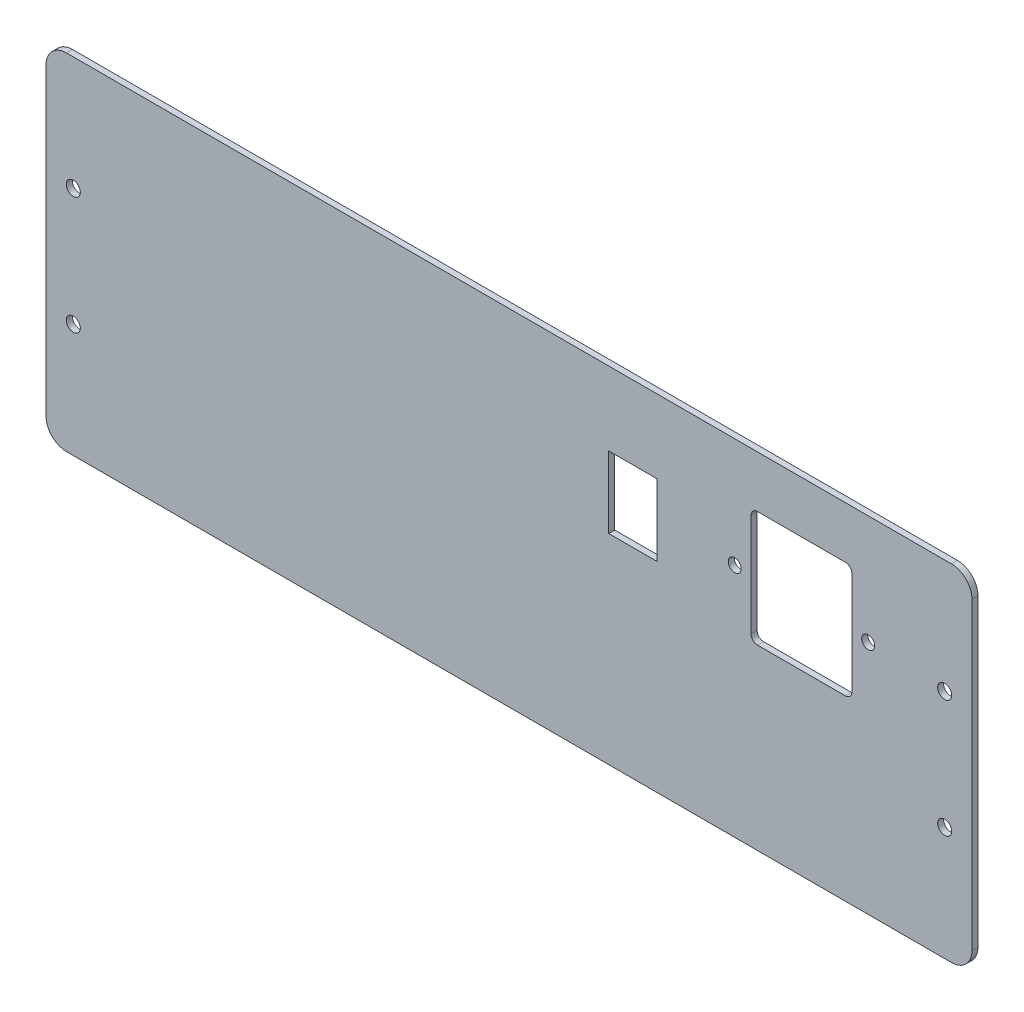
ISO-10303-21;
HEADER;
FILE_DESCRIPTION(('STEP AP214'),'2;1');
FILE_NAME('part.step','',(''),(''),'','','');
FILE_SCHEMA(('AUTOMOTIVE_DESIGN { 1 0 10303 214 1 1 1 1 }'));
ENDSEC;
DATA;
#1=APPLICATION_CONTEXT('core data for automotive mechanical design processes');
#2=APPLICATION_PROTOCOL_DEFINITION('international standard','automotive_design',2000,#1);
#3=PRODUCT_CONTEXT('',#1,'mechanical');
#4=PRODUCT('Part','Part','',(#3));
#5=PRODUCT_RELATED_PRODUCT_CATEGORY('part','',(#4));
#6=PRODUCT_DEFINITION_FORMATION('','',#4);
#7=PRODUCT_DEFINITION_CONTEXT('part definition',#1,'design');
#8=PRODUCT_DEFINITION('design','',#6,#7);
#9=PRODUCT_DEFINITION_SHAPE('','',#8);
#10=(LENGTH_UNIT() NAMED_UNIT(*) SI_UNIT(.MILLI.,.METRE.));
#11=(NAMED_UNIT(*) PLANE_ANGLE_UNIT() SI_UNIT($,.RADIAN.));
#12=(NAMED_UNIT(*) SI_UNIT($,.STERADIAN.) SOLID_ANGLE_UNIT());
#13=UNCERTAINTY_MEASURE_WITH_UNIT(LENGTH_MEASURE(1.E-05),#10,'distance_accuracy_value','');
#14=(GEOMETRIC_REPRESENTATION_CONTEXT(3) GLOBAL_UNCERTAINTY_ASSIGNED_CONTEXT((#13)) GLOBAL_UNIT_ASSIGNED_CONTEXT((#10,
#11,#12)) REPRESENTATION_CONTEXT('',''));
#15=CARTESIAN_POINT('',(0.,0.,0.));
#16=DIRECTION('',(0.,0.,1.));
#17=DIRECTION('',(1.,0.,0.));
#18=AXIS2_PLACEMENT_3D('',#15,#16,#17);
#19=CARTESIAN_POINT('',(0.,0.,-1.6256));
#20=DIRECTION('',(0.,0.,1.));
#21=DIRECTION('',(1.,0.,0.));
#22=AXIS2_PLACEMENT_3D('',#19,#20,#21);
#23=PLANE('',#22);
#24=CARTESIAN_POINT('',(60.9045,17.0291,-1.6256));
#25=DIRECTION('',(0.,0.,1.));
#26=DIRECTION('',(-1.,0.,0.));
#27=AXIS2_PLACEMENT_3D('',#24,#25,#26);
#28=CIRCLE('',#27,1.75);
#29=CARTESIAN_POINT('',(59.1545,17.0291,-1.6256));
#30=VERTEX_POINT('',#29);
#31=EDGE_CURVE('E222',#30,#30,#28,.T.);
#32=ORIENTED_EDGE('',*,*,#31,.T.);
#33=EDGE_LOOP('',(#32));
#34=FACE_BOUND('',#33,.T.);
#35=CARTESIAN_POINT('',(96.9045,17.0291,-1.6256));
#36=DIRECTION('',(0.,0.,1.));
#37=DIRECTION('',(-1.,0.,0.));
#38=AXIS2_PLACEMENT_3D('',#35,#36,#37);
#39=CIRCLE('',#38,1.75);
#40=CARTESIAN_POINT('',(95.1545,17.0291,-1.6256));
#41=VERTEX_POINT('',#40);
#42=EDGE_CURVE('E240',#41,#41,#39,.T.);
#43=ORIENTED_EDGE('',*,*,#42,.T.);
#44=EDGE_LOOP('',(#43));
#45=FACE_BOUND('',#44,.T.);
#46=DIRECTION('',(0.,-1.,0.));
#47=VECTOR('',#46,1.);
#48=CARTESIAN_POINT('',(-124.9045,41.0337,-1.6256));
#49=LINE('',#48,#47);
#50=CARTESIAN_POINT('',(-124.9045,41.0337,-1.6256));
#51=VERTEX_POINT('',#50);
#52=CARTESIAN_POINT('',(-124.9045,-41.0337,-1.6256));
#53=VERTEX_POINT('',#52);
#54=EDGE_CURVE('E290',#51,#53,#49,.T.);
#55=ORIENTED_EDGE('',*,*,#54,.F.);
#56=CARTESIAN_POINT('',(-119.3673,41.0337,-1.6256));
#57=DIRECTION('',(0.,0.,1.));
#58=DIRECTION('',(0.,1.,0.));
#59=AXIS2_PLACEMENT_3D('',#56,#57,#58);
#60=CIRCLE('',#59,5.5372);
#61=CARTESIAN_POINT('',(-119.3673,46.5709,-1.6256));
#62=VERTEX_POINT('',#61);
#63=EDGE_CURVE('E318',#62,#51,#60,.T.);
#64=ORIENTED_EDGE('',*,*,#63,.F.);
#65=DIRECTION('',(-1.,0.,0.));
#66=VECTOR('',#65,1.);
#67=CARTESIAN_POINT('',(119.3673,46.5709,-1.6256));
#68=LINE('',#67,#66);
#69=CARTESIAN_POINT('',(119.3673,46.5709,-1.6256));
#70=VERTEX_POINT('',#69);
#71=EDGE_CURVE('E300',#70,#62,#68,.T.);
#72=ORIENTED_EDGE('',*,*,#71,.F.);
#73=CARTESIAN_POINT('',(119.3673,41.0337,-1.6256));
#74=DIRECTION('',(0.,0.,1.));
#75=DIRECTION('',(1.,0.,0.));
#76=AXIS2_PLACEMENT_3D('',#73,#74,#75);
#77=CIRCLE('',#76,5.5372);
#78=CARTESIAN_POINT('',(124.9045,41.0337,-1.6256));
#79=VERTEX_POINT('',#78);
#80=EDGE_CURVE('E299',#79,#70,#77,.T.);
#81=ORIENTED_EDGE('',*,*,#80,.F.);
#82=DIRECTION('',(0.,1.,0.));
#83=VECTOR('',#82,1.);
#84=CARTESIAN_POINT('',(124.9045,-41.0337,-1.6256));
#85=LINE('',#84,#83);
#86=CARTESIAN_POINT('',(124.9045,-41.0337,-1.6256));
#87=VERTEX_POINT('',#86);
#88=EDGE_CURVE('E284',#87,#79,#85,.T.);
#89=ORIENTED_EDGE('',*,*,#88,.F.);
#90=CARTESIAN_POINT('',(119.3673,-41.0337,-1.6256));
#91=DIRECTION('',(0.,0.,1.));
#92=DIRECTION('',(0.,-1.,0.));
#93=AXIS2_PLACEMENT_3D('',#90,#91,#92);
#94=CIRCLE('',#93,5.5372);
#95=CARTESIAN_POINT('',(119.3673,-46.5709,-1.6256));
#96=VERTEX_POINT('',#95);
#97=EDGE_CURVE('E283',#96,#87,#94,.T.);
#98=ORIENTED_EDGE('',*,*,#97,.F.);
#99=DIRECTION('',(1.,0.,0.));
#100=VECTOR('',#99,1.);
#101=CARTESIAN_POINT('',(-119.3673,-46.5709,-1.6256));
#102=LINE('',#101,#100);
#103=CARTESIAN_POINT('',(-119.3673,-46.5709,-1.6256));
#104=VERTEX_POINT('',#103);
#105=EDGE_CURVE('E276',#104,#96,#102,.T.);
#106=ORIENTED_EDGE('',*,*,#105,.F.);
#107=CARTESIAN_POINT('',(-119.3673,-41.0337,-1.6256));
#108=DIRECTION('',(0.,0.,1.));
#109=DIRECTION('',(-1.,0.,0.));
#110=AXIS2_PLACEMENT_3D('',#107,#108,#109);
#111=CIRCLE('',#110,5.5372);
#112=EDGE_CURVE('E275',#53,#104,#111,.T.);
#113=ORIENTED_EDGE('',*,*,#112,.F.);
#114=EDGE_LOOP('',(#55,#64,#72,#81,#89,#98,#106,#113));
#115=FACE_BOUND('',#114,.T.);
#116=CARTESIAN_POINT('',(117.5385,-15.8877,-1.6256));
#117=DIRECTION('',(0.,0.,1.));
#118=DIRECTION('',(-1.,0.,0.));
#119=AXIS2_PLACEMENT_3D('',#116,#117,#118);
#120=CIRCLE('',#119,1.8923);
#121=CARTESIAN_POINT('',(115.6462,-15.8877,-1.6256));
#122=VERTEX_POINT('',#121);
#123=EDGE_CURVE('E285',#122,#122,#120,.T.);
#124=ORIENTED_EDGE('',*,*,#123,.T.);
#125=EDGE_LOOP('',(#124));
#126=FACE_BOUND('',#125,.T.);
#127=CARTESIAN_POINT('',(117.5385,15.8623,-1.6256));
#128=DIRECTION('',(0.,0.,1.));
#129=DIRECTION('',(-1.,0.,0.));
#130=AXIS2_PLACEMENT_3D('',#127,#128,#129);
#131=CIRCLE('',#130,1.8923);
#132=CARTESIAN_POINT('',(115.6462,15.8623,-1.6256));
#133=VERTEX_POINT('',#132);
#134=EDGE_CURVE('E265',#133,#133,#131,.T.);
#135=ORIENTED_EDGE('',*,*,#134,.T.);
#136=EDGE_LOOP('',(#135));
#137=FACE_BOUND('',#136,.T.);
#138=CARTESIAN_POINT('',(-117.5385,-15.8877,-1.6256));
#139=DIRECTION('',(0.,0.,1.));
#140=DIRECTION('',(-1.,0.,0.));
#141=AXIS2_PLACEMENT_3D('',#138,#139,#140);
#142=CIRCLE('',#141,1.8923);
#143=CARTESIAN_POINT('',(-119.4308,-15.8877,-1.6256));
#144=VERTEX_POINT('',#143);
#145=EDGE_CURVE('E261',#144,#144,#142,.T.);
#146=ORIENTED_EDGE('',*,*,#145,.T.);
#147=EDGE_LOOP('',(#146));
#148=FACE_BOUND('',#147,.T.);
#149=CARTESIAN_POINT('',(-117.5385,15.8623,-1.6256));
#150=DIRECTION('',(0.,0.,1.));
#151=DIRECTION('',(-1.,0.,0.));
#152=AXIS2_PLACEMENT_3D('',#149,#150,#151);
#153=CIRCLE('',#152,1.8923);
#154=CARTESIAN_POINT('',(-119.4308,15.8623,-1.6256));
#155=VERTEX_POINT('',#154);
#156=EDGE_CURVE('E266',#155,#155,#153,.T.);
#157=ORIENTED_EDGE('',*,*,#156,.T.);
#158=EDGE_LOOP('',(#157));
#159=FACE_BOUND('',#158,.T.);
#160=DIRECTION('',(-1.,0.,0.));
#161=VECTOR('',#160,1.);
#162=CARTESIAN_POINT('',(92.5045,32.6291,-1.6256));
#163=LINE('',#162,#161);
#164=CARTESIAN_POINT('',(90.7545,32.6291,-1.6256));
#165=VERTEX_POINT('',#164);
#166=CARTESIAN_POINT('',(67.0545,32.6291,-1.6256));
#167=VERTEX_POINT('',#166);
#168=EDGE_CURVE('E234',#165,#167,#163,.T.);
#169=ORIENTED_EDGE('',*,*,#168,.T.);
#170=CARTESIAN_POINT('',(67.0545,30.8791,-1.6256));
#171=DIRECTION('',(0.,0.,1.));
#172=DIRECTION('',(1.,0.,0.));
#173=AXIS2_PLACEMENT_3D('',#170,#171,#172);
#174=CIRCLE('',#173,1.75);
#175=CARTESIAN_POINT('',(65.3045,30.8791,-1.6256));
#176=VERTEX_POINT('',#175);
#177=EDGE_CURVE('E34',#167,#176,#174,.T.);
#178=ORIENTED_EDGE('',*,*,#177,.T.);
#179=DIRECTION('',(0.,-1.,0.));
#180=VECTOR('',#179,1.);
#181=CARTESIAN_POINT('',(65.3045,32.6291,-1.6256));
#182=LINE('',#181,#180);
#183=CARTESIAN_POINT('',(65.3045,3.1791,-1.6256));
#184=VERTEX_POINT('',#183);
#185=EDGE_CURVE('E237',#176,#184,#182,.T.);
#186=ORIENTED_EDGE('',*,*,#185,.T.);
#187=CARTESIAN_POINT('',(67.0545,3.1791,-1.6256));
#188=DIRECTION('',(0.,0.,1.));
#189=DIRECTION('',(1.,0.,0.));
#190=AXIS2_PLACEMENT_3D('',#187,#188,#189);
#191=CIRCLE('',#190,1.75);
#192=CARTESIAN_POINT('',(67.0545,1.4291,-1.6256));
#193=VERTEX_POINT('',#192);
#194=EDGE_CURVE('E424',#184,#193,#191,.T.);
#195=ORIENTED_EDGE('',*,*,#194,.T.);
#196=DIRECTION('',(1.,0.,0.));
#197=VECTOR('',#196,1.);
#198=CARTESIAN_POINT('',(65.3045,1.4291,-1.6256));
#199=LINE('',#198,#197);
#200=CARTESIAN_POINT('',(90.7545,1.4291,-1.6256));
#201=VERTEX_POINT('',#200);
#202=EDGE_CURVE('E230',#193,#201,#199,.T.);
#203=ORIENTED_EDGE('',*,*,#202,.T.);
#204=CARTESIAN_POINT('',(90.7545,3.1791,-1.6256));
#205=DIRECTION('',(0.,0.,1.));
#206=DIRECTION('',(1.,0.,0.));
#207=AXIS2_PLACEMENT_3D('',#204,#205,#206);
#208=CIRCLE('',#207,1.75);
#209=CARTESIAN_POINT('',(92.5045,3.1791,-1.6256));
#210=VERTEX_POINT('',#209);
#211=EDGE_CURVE('E411',#201,#210,#208,.T.);
#212=ORIENTED_EDGE('',*,*,#211,.T.);
#213=DIRECTION('',(0.,1.,0.));
#214=VECTOR('',#213,1.);
#215=CARTESIAN_POINT('',(92.5045,1.4291,-1.6256));
#216=LINE('',#215,#214);
#217=CARTESIAN_POINT('',(92.5045,30.8791,-1.6256));
#218=VERTEX_POINT('',#217);
#219=EDGE_CURVE('E231',#210,#218,#216,.T.);
#220=ORIENTED_EDGE('',*,*,#219,.T.);
#221=CARTESIAN_POINT('',(90.7545,30.8791,-1.6256));
#222=DIRECTION('',(0.,0.,1.));
#223=DIRECTION('',(1.,0.,0.));
#224=AXIS2_PLACEMENT_3D('',#221,#222,#223);
#225=CIRCLE('',#224,1.75);
#226=EDGE_CURVE('E398',#218,#165,#225,.T.);
#227=ORIENTED_EDGE('',*,*,#226,.T.);
#228=EDGE_LOOP('',(#169,#178,#186,#195,#203,#212,#220,#227));
#229=FACE_BOUND('',#228,.T.);
#230=DIRECTION('',(-1.,0.,0.));
#231=VECTOR('',#230,1.);
#232=CARTESIAN_POINT('',(39.9045,26.7268255373213,-1.6256));
#233=LINE('',#232,#231);
#234=CARTESIAN_POINT('',(39.9045,26.7268255373213,-1.6256));
#235=VERTEX_POINT('',#234);
#236=CARTESIAN_POINT('',(26.9045,26.7268255373213,-1.6256));
#237=VERTEX_POINT('',#236);
#238=EDGE_CURVE('E204',#235,#237,#233,.T.);
#239=ORIENTED_EDGE('',*,*,#238,.T.);
#240=DIRECTION('',(0.,-1.,0.));
#241=VECTOR('',#240,1.);
#242=CARTESIAN_POINT('',(26.9045,26.7268255373213,-1.6256));
#243=LINE('',#242,#241);
#244=CARTESIAN_POINT('',(26.9045,7.42682553732137,-1.6256));
#245=VERTEX_POINT('',#244);
#246=EDGE_CURVE('E182',#237,#245,#243,.T.);
#247=ORIENTED_EDGE('',*,*,#246,.T.);
#248=DIRECTION('',(1.,0.,0.));
#249=VECTOR('',#248,1.);
#250=CARTESIAN_POINT('',(26.9045,7.42682553732137,-1.6256));
#251=LINE('',#250,#249);
#252=CARTESIAN_POINT('',(39.9045,7.42682553732137,-1.6256));
#253=VERTEX_POINT('',#252);
#254=EDGE_CURVE('E193',#245,#253,#251,.T.);
#255=ORIENTED_EDGE('',*,*,#254,.T.);
#256=DIRECTION('',(0.,1.,0.));
#257=VECTOR('',#256,1.);
#258=CARTESIAN_POINT('',(39.9045,7.42682553732137,-1.6256));
#259=LINE('',#258,#257);
#260=EDGE_CURVE('E200',#253,#235,#259,.T.);
#261=ORIENTED_EDGE('',*,*,#260,.T.);
#262=EDGE_LOOP('',(#239,#247,#255,#261));
#263=FACE_BOUND('',#262,.T.);
#264=ADVANCED_FACE('F25',(#34,#45,#115,#126,#137,#148,#159,#229,#263),#23,.F.);
#265=CARTESIAN_POINT('',(0.,0.,0.));
#266=DIRECTION('',(0.,0.,1.));
#267=DIRECTION('',(1.,0.,0.));
#268=AXIS2_PLACEMENT_3D('',#265,#266,#267);
#269=PLANE('',#268);
#270=CARTESIAN_POINT('',(60.9045,17.0291,0.));
#271=DIRECTION('',(0.,0.,1.));
#272=DIRECTION('',(1.,0.,0.));
#273=AXIS2_PLACEMENT_3D('',#270,#271,#272);
#274=CIRCLE('',#273,1.75);
#275=CARTESIAN_POINT('',(62.6545,17.0291,0.));
#276=VERTEX_POINT('',#275);
#277=EDGE_CURVE('E226',#276,#276,#274,.F.);
#278=ORIENTED_EDGE('',*,*,#277,.T.);
#279=EDGE_LOOP('',(#278));
#280=FACE_BOUND('',#279,.T.);
#281=CARTESIAN_POINT('',(96.9045,17.0291,0.));
#282=DIRECTION('',(0.,0.,1.));
#283=DIRECTION('',(1.,0.,0.));
#284=AXIS2_PLACEMENT_3D('',#281,#282,#283);
#285=CIRCLE('',#284,1.75);
#286=CARTESIAN_POINT('',(98.6545,17.0291,0.));
#287=VERTEX_POINT('',#286);
#288=EDGE_CURVE('E246',#287,#287,#285,.F.);
#289=ORIENTED_EDGE('',*,*,#288,.T.);
#290=EDGE_LOOP('',(#289));
#291=FACE_BOUND('',#290,.T.);
#292=CARTESIAN_POINT('',(-119.3673,41.0337,0.));
#293=DIRECTION('',(0.,0.,1.));
#294=DIRECTION('',(0.,1.,0.));
#295=AXIS2_PLACEMENT_3D('',#292,#293,#294);
#296=CIRCLE('',#295,5.5372);
#297=CARTESIAN_POINT('',(-119.3673,46.5709,0.));
#298=VERTEX_POINT('',#297);
#299=CARTESIAN_POINT('',(-124.9045,41.0337,0.));
#300=VERTEX_POINT('',#299);
#301=EDGE_CURVE('E254',#298,#300,#296,.T.);
#302=ORIENTED_EDGE('',*,*,#301,.T.);
#303=DIRECTION('',(0.,-1.,0.));
#304=VECTOR('',#303,1.);
#305=CARTESIAN_POINT('',(-124.9045,41.0337,0.));
#306=LINE('',#305,#304);
#307=CARTESIAN_POINT('',(-124.9045,-41.0337,0.));
#308=VERTEX_POINT('',#307);
#309=EDGE_CURVE('E251',#300,#308,#306,.T.);
#310=ORIENTED_EDGE('',*,*,#309,.T.);
#311=CARTESIAN_POINT('',(-119.3673,-41.0337,0.));
#312=DIRECTION('',(0.,0.,1.));
#313=DIRECTION('',(-1.,0.,0.));
#314=AXIS2_PLACEMENT_3D('',#311,#312,#313);
#315=CIRCLE('',#314,5.5372);
#316=CARTESIAN_POINT('',(-119.3673,-46.5709,0.));
#317=VERTEX_POINT('',#316);
#318=EDGE_CURVE('E255',#308,#317,#315,.T.);
#319=ORIENTED_EDGE('',*,*,#318,.T.);
#320=DIRECTION('',(1.,0.,0.));
#321=VECTOR('',#320,1.);
#322=CARTESIAN_POINT('',(-119.3673,-46.5709,0.));
#323=LINE('',#322,#321);
#324=CARTESIAN_POINT('',(119.3673,-46.5709,0.));
#325=VERTEX_POINT('',#324);
#326=EDGE_CURVE('E323',#317,#325,#323,.T.);
#327=ORIENTED_EDGE('',*,*,#326,.T.);
#328=CARTESIAN_POINT('',(119.3673,-41.0337,0.));
#329=DIRECTION('',(0.,0.,1.));
#330=DIRECTION('',(0.,-1.,0.));
#331=AXIS2_PLACEMENT_3D('',#328,#329,#330);
#332=CIRCLE('',#331,5.5372);
#333=CARTESIAN_POINT('',(124.9045,-41.0337,0.));
#334=VERTEX_POINT('',#333);
#335=EDGE_CURVE('E313',#325,#334,#332,.T.);
#336=ORIENTED_EDGE('',*,*,#335,.T.);
#337=DIRECTION('',(0.,1.,0.));
#338=VECTOR('',#337,1.);
#339=CARTESIAN_POINT('',(124.9045,-41.0337,0.));
#340=LINE('',#339,#338);
#341=CARTESIAN_POINT('',(124.9045,41.0337,0.));
#342=VERTEX_POINT('',#341);
#343=EDGE_CURVE('E259',#334,#342,#340,.T.);
#344=ORIENTED_EDGE('',*,*,#343,.T.);
#345=CARTESIAN_POINT('',(119.3673,41.0337,0.));
#346=DIRECTION('',(0.,0.,1.));
#347=DIRECTION('',(1.,0.,0.));
#348=AXIS2_PLACEMENT_3D('',#345,#346,#347);
#349=CIRCLE('',#348,5.5372);
#350=CARTESIAN_POINT('',(119.3673,46.5709,0.));
#351=VERTEX_POINT('',#350);
#352=EDGE_CURVE('E256',#342,#351,#349,.T.);
#353=ORIENTED_EDGE('',*,*,#352,.T.);
#354=DIRECTION('',(-1.,0.,0.));
#355=VECTOR('',#354,1.);
#356=CARTESIAN_POINT('',(119.3673,46.5709,0.));
#357=LINE('',#356,#355);
#358=EDGE_CURVE('E260',#351,#298,#357,.T.);
#359=ORIENTED_EDGE('',*,*,#358,.T.);
#360=EDGE_LOOP('',(#302,#310,#319,#327,#336,#344,#353,#359));
#361=FACE_BOUND('',#360,.T.);
#362=CARTESIAN_POINT('',(117.5385,-15.8877,0.));
#363=DIRECTION('',(0.,0.,-1.));
#364=DIRECTION('',(-1.,0.,0.));
#365=AXIS2_PLACEMENT_3D('',#362,#363,#364);
#366=CIRCLE('',#365,1.8923);
#367=CARTESIAN_POINT('',(115.6462,-15.8877,0.));
#368=VERTEX_POINT('',#367);
#369=EDGE_CURVE('E267',#368,#368,#366,.T.);
#370=ORIENTED_EDGE('',*,*,#369,.T.);
#371=EDGE_LOOP('',(#370));
#372=FACE_BOUND('',#371,.T.);
#373=CARTESIAN_POINT('',(117.5385,15.8623,0.));
#374=DIRECTION('',(0.,0.,-1.));
#375=DIRECTION('',(-1.,0.,0.));
#376=AXIS2_PLACEMENT_3D('',#373,#374,#375);
#377=CIRCLE('',#376,1.8923);
#378=CARTESIAN_POINT('',(115.6462,15.8623,0.));
#379=VERTEX_POINT('',#378);
#380=EDGE_CURVE('E271',#379,#379,#377,.T.);
#381=ORIENTED_EDGE('',*,*,#380,.T.);
#382=EDGE_LOOP('',(#381));
#383=FACE_BOUND('',#382,.T.);
#384=CARTESIAN_POINT('',(-117.5385,-15.8877,0.));
#385=DIRECTION('',(0.,0.,-1.));
#386=DIRECTION('',(-1.,0.,0.));
#387=AXIS2_PLACEMENT_3D('',#384,#385,#386);
#388=CIRCLE('',#387,1.8923);
#389=CARTESIAN_POINT('',(-119.4308,-15.8877,0.));
#390=VERTEX_POINT('',#389);
#391=EDGE_CURVE('E304',#390,#390,#388,.T.);
#392=ORIENTED_EDGE('',*,*,#391,.T.);
#393=EDGE_LOOP('',(#392));
#394=FACE_BOUND('',#393,.T.);
#395=CARTESIAN_POINT('',(-117.5385,15.8623,0.));
#396=DIRECTION('',(0.,0.,-1.));
#397=DIRECTION('',(-1.,0.,0.));
#398=AXIS2_PLACEMENT_3D('',#395,#396,#397);
#399=CIRCLE('',#398,1.8923);
#400=CARTESIAN_POINT('',(-119.4308,15.8623,0.));
#401=VERTEX_POINT('',#400);
#402=EDGE_CURVE('E250',#401,#401,#399,.T.);
#403=ORIENTED_EDGE('',*,*,#402,.T.);
#404=EDGE_LOOP('',(#403));
#405=FACE_BOUND('',#404,.T.);
#406=DIRECTION('',(0.,1.,0.));
#407=VECTOR('',#406,1.);
#408=CARTESIAN_POINT('',(65.3045,0.,0.));
#409=LINE('',#408,#407);
#410=CARTESIAN_POINT('',(65.3045,3.1791,0.));
#411=VERTEX_POINT('',#410);
#412=CARTESIAN_POINT('',(65.3045,30.8791,0.));
#413=VERTEX_POINT('',#412);
#414=EDGE_CURVE('E294',#411,#413,#409,.T.);
#415=ORIENTED_EDGE('',*,*,#414,.T.);
#416=CARTESIAN_POINT('',(67.0545,30.8791,0.));
#417=DIRECTION('',(0.,0.,1.));
#418=DIRECTION('',(1.,0.,0.));
#419=AXIS2_PLACEMENT_3D('',#416,#417,#418);
#420=CIRCLE('',#419,1.75);
#421=CARTESIAN_POINT('',(67.0545,32.6291,0.));
#422=VERTEX_POINT('',#421);
#423=EDGE_CURVE('E13',#413,#422,#420,.F.);
#424=ORIENTED_EDGE('',*,*,#423,.T.);
#425=DIRECTION('',(1.,0.,0.));
#426=VECTOR('',#425,1.);
#427=CARTESIAN_POINT('',(0.,32.6291,0.));
#428=LINE('',#427,#426);
#429=CARTESIAN_POINT('',(90.7545,32.6291,0.));
#430=VERTEX_POINT('',#429);
#431=EDGE_CURVE('E373',#422,#430,#428,.T.);
#432=ORIENTED_EDGE('',*,*,#431,.T.);
#433=CARTESIAN_POINT('',(90.7545,30.8791,0.));
#434=DIRECTION('',(0.,0.,1.));
#435=DIRECTION('',(1.,0.,0.));
#436=AXIS2_PLACEMENT_3D('',#433,#434,#435);
#437=CIRCLE('',#436,1.75);
#438=CARTESIAN_POINT('',(92.5045,30.8791,0.));
#439=VERTEX_POINT('',#438);
#440=EDGE_CURVE('E401',#430,#439,#437,.F.);
#441=ORIENTED_EDGE('',*,*,#440,.T.);
#442=DIRECTION('',(0.,-1.,0.));
#443=VECTOR('',#442,1.);
#444=CARTESIAN_POINT('',(92.5045,0.,0.));
#445=LINE('',#444,#443);
#446=CARTESIAN_POINT('',(92.5045,3.1791,0.));
#447=VERTEX_POINT('',#446);
#448=EDGE_CURVE('E369',#439,#447,#445,.T.);
#449=ORIENTED_EDGE('',*,*,#448,.T.);
#450=CARTESIAN_POINT('',(90.7545,3.1791,0.));
#451=DIRECTION('',(0.,0.,1.));
#452=DIRECTION('',(1.,0.,0.));
#453=AXIS2_PLACEMENT_3D('',#450,#451,#452);
#454=CIRCLE('',#453,1.75);
#455=CARTESIAN_POINT('',(90.7545,1.4291,0.));
#456=VERTEX_POINT('',#455);
#457=EDGE_CURVE('E414',#447,#456,#454,.F.);
#458=ORIENTED_EDGE('',*,*,#457,.T.);
#459=DIRECTION('',(-1.,0.,0.));
#460=VECTOR('',#459,1.);
#461=CARTESIAN_POINT('',(0.,1.4291,0.));
#462=LINE('',#461,#460);
#463=CARTESIAN_POINT('',(67.0545,1.4291,0.));
#464=VERTEX_POINT('',#463);
#465=EDGE_CURVE('E364',#456,#464,#462,.T.);
#466=ORIENTED_EDGE('',*,*,#465,.T.);
#467=CARTESIAN_POINT('',(67.0545,3.1791,0.));
#468=DIRECTION('',(0.,0.,1.));
#469=DIRECTION('',(1.,0.,0.));
#470=AXIS2_PLACEMENT_3D('',#467,#468,#469);
#471=CIRCLE('',#470,1.75);
#472=EDGE_CURVE('E427',#464,#411,#471,.F.);
#473=ORIENTED_EDGE('',*,*,#472,.T.);
#474=EDGE_LOOP('',(#415,#424,#432,#441,#449,#458,#466,#473));
#475=FACE_BOUND('',#474,.T.);
#476=DIRECTION('',(0.,1.,0.));
#477=VECTOR('',#476,1.);
#478=CARTESIAN_POINT('',(26.9045,0.,0.));
#479=LINE('',#478,#477);
#480=CARTESIAN_POINT('',(26.9045,7.42682553732137,0.));
#481=VERTEX_POINT('',#480);
#482=CARTESIAN_POINT('',(26.9045,26.7268255373213,0.));
#483=VERTEX_POINT('',#482);
#484=EDGE_CURVE('E185',#481,#483,#479,.T.);
#485=ORIENTED_EDGE('',*,*,#484,.T.);
#486=DIRECTION('',(1.,0.,0.));
#487=VECTOR('',#486,1.);
#488=CARTESIAN_POINT('',(0.,26.7268255373213,0.));
#489=LINE('',#488,#487);
#490=CARTESIAN_POINT('',(39.9045,26.7268255373213,0.));
#491=VERTEX_POINT('',#490);
#492=EDGE_CURVE('E378',#483,#491,#489,.T.);
#493=ORIENTED_EDGE('',*,*,#492,.T.);
#494=DIRECTION('',(0.,-1.,0.));
#495=VECTOR('',#494,1.);
#496=CARTESIAN_POINT('',(39.9045,0.,0.));
#497=LINE('',#496,#495);
#498=CARTESIAN_POINT('',(39.9045,7.42682553732137,0.));
#499=VERTEX_POINT('',#498);
#500=EDGE_CURVE('E368',#491,#499,#497,.T.);
#501=ORIENTED_EDGE('',*,*,#500,.T.);
#502=DIRECTION('',(-1.,0.,0.));
#503=VECTOR('',#502,1.);
#504=CARTESIAN_POINT('',(0.,7.42682553732137,0.));
#505=LINE('',#504,#503);
#506=EDGE_CURVE('E385',#499,#481,#505,.T.);
#507=ORIENTED_EDGE('',*,*,#506,.T.);
#508=EDGE_LOOP('',(#485,#493,#501,#507));
#509=FACE_BOUND('',#508,.T.);
#510=ADVANCED_FACE('F606',(#280,#291,#361,#372,#383,#394,#405,#475,#509),#269,.T.);
#511=CARTESIAN_POINT('',(117.5385,-15.8877,0.));
#512=DIRECTION('',(0.,0.,-1.));
#513=DIRECTION('',(-1.,0.,0.));
#514=AXIS2_PLACEMENT_3D('',#511,#512,#513);
#515=CYLINDRICAL_SURFACE('',#514,1.8923);
#516=ORIENTED_EDGE('',*,*,#123,.F.);
#517=EDGE_LOOP('',(#516));
#518=FACE_BOUND('',#517,.T.);
#519=ORIENTED_EDGE('',*,*,#369,.F.);
#520=EDGE_LOOP('',(#519));
#521=FACE_BOUND('',#520,.T.);
#522=ADVANCED_FACE('F599',(#518,#521),#515,.F.);
#523=CARTESIAN_POINT('',(117.5385,15.8623,0.));
#524=DIRECTION('',(0.,0.,-1.));
#525=DIRECTION('',(-1.,0.,0.));
#526=AXIS2_PLACEMENT_3D('',#523,#524,#525);
#527=CYLINDRICAL_SURFACE('',#526,1.8923);
#528=ORIENTED_EDGE('',*,*,#134,.F.);
#529=EDGE_LOOP('',(#528));
#530=FACE_BOUND('',#529,.T.);
#531=ORIENTED_EDGE('',*,*,#380,.F.);
#532=EDGE_LOOP('',(#531));
#533=FACE_BOUND('',#532,.T.);
#534=ADVANCED_FACE('F605',(#530,#533),#527,.F.);
#535=CARTESIAN_POINT('',(-117.5385,-15.8877,0.));
#536=DIRECTION('',(0.,0.,-1.));
#537=DIRECTION('',(-1.,0.,0.));
#538=AXIS2_PLACEMENT_3D('',#535,#536,#537);
#539=CYLINDRICAL_SURFACE('',#538,1.8923);
#540=ORIENTED_EDGE('',*,*,#145,.F.);
#541=EDGE_LOOP('',(#540));
#542=FACE_BOUND('',#541,.T.);
#543=ORIENTED_EDGE('',*,*,#391,.F.);
#544=EDGE_LOOP('',(#543));
#545=FACE_BOUND('',#544,.T.);
#546=ADVANCED_FACE('F676',(#542,#545),#539,.F.);
#547=CARTESIAN_POINT('',(-117.5385,15.8623,0.));
#548=DIRECTION('',(0.,0.,-1.));
#549=DIRECTION('',(-1.,0.,0.));
#550=AXIS2_PLACEMENT_3D('',#547,#548,#549);
#551=CYLINDRICAL_SURFACE('',#550,1.8923);
#552=ORIENTED_EDGE('',*,*,#156,.F.);
#553=EDGE_LOOP('',(#552));
#554=FACE_BOUND('',#553,.T.);
#555=ORIENTED_EDGE('',*,*,#402,.F.);
#556=EDGE_LOOP('',(#555));
#557=FACE_BOUND('',#556,.T.);
#558=ADVANCED_FACE('F648',(#554,#557),#551,.F.);
#559=CARTESIAN_POINT('',(-124.9045,41.0337,0.));
#560=DIRECTION('',(-1.,0.,0.));
#561=DIRECTION('',(0.,1.,0.));
#562=AXIS2_PLACEMENT_3D('',#559,#560,#561);
#563=PLANE('',#562);
#564=ORIENTED_EDGE('',*,*,#54,.T.);
#565=DIRECTION('',(0.,0.,-1.));
#566=VECTOR('',#565,1.);
#567=CARTESIAN_POINT('',(-124.9045,-41.0337,0.));
#568=LINE('',#567,#566);
#569=EDGE_CURVE('E272',#308,#53,#568,.T.);
#570=ORIENTED_EDGE('',*,*,#569,.F.);
#571=ORIENTED_EDGE('',*,*,#309,.F.);
#572=DIRECTION('',(0.,0.,-1.));
#573=VECTOR('',#572,1.);
#574=CARTESIAN_POINT('',(-124.9045,41.0337,0.));
#575=LINE('',#574,#573);
#576=EDGE_CURVE('E295',#300,#51,#575,.T.);
#577=ORIENTED_EDGE('',*,*,#576,.T.);
#578=EDGE_LOOP('',(#564,#570,#571,#577));
#579=FACE_BOUND('',#578,.T.);
#580=ADVANCED_FACE('F636',(#579),#563,.T.);
#581=CARTESIAN_POINT('',(-119.3673,-41.0337,0.));
#582=DIRECTION('',(0.,0.,-1.));
#583=DIRECTION('',(-1.,0.,0.));
#584=AXIS2_PLACEMENT_3D('',#581,#582,#583);
#585=CYLINDRICAL_SURFACE('',#584,5.5372);
#586=ORIENTED_EDGE('',*,*,#112,.T.);
#587=DIRECTION('',(0.,0.,-1.));
#588=VECTOR('',#587,1.);
#589=CARTESIAN_POINT('',(-119.3673,-46.5709,0.));
#590=LINE('',#589,#588);
#591=EDGE_CURVE('E317',#317,#104,#590,.T.);
#592=ORIENTED_EDGE('',*,*,#591,.F.);
#593=ORIENTED_EDGE('',*,*,#318,.F.);
#594=ORIENTED_EDGE('',*,*,#569,.T.);
#595=EDGE_LOOP('',(#586,#592,#593,#594));
#596=FACE_BOUND('',#595,.T.);
#597=ADVANCED_FACE('F623',(#596),#585,.T.);
#598=CARTESIAN_POINT('',(-119.3673,-46.5709,0.));
#599=DIRECTION('',(0.,-1.,0.));
#600=DIRECTION('',(0.,0.,-1.));
#601=AXIS2_PLACEMENT_3D('',#598,#599,#600);
#602=PLANE('',#601);
#603=ORIENTED_EDGE('',*,*,#105,.T.);
#604=DIRECTION('',(0.,0.,-1.));
#605=VECTOR('',#604,1.);
#606=CARTESIAN_POINT('',(119.3673,-46.5709,0.));
#607=LINE('',#606,#605);
#608=EDGE_CURVE('E280',#325,#96,#607,.T.);
#609=ORIENTED_EDGE('',*,*,#608,.F.);
#610=ORIENTED_EDGE('',*,*,#326,.F.);
#611=ORIENTED_EDGE('',*,*,#591,.T.);
#612=EDGE_LOOP('',(#603,#609,#610,#611));
#613=FACE_BOUND('',#612,.T.);
#614=ADVANCED_FACE('F617',(#613),#602,.T.);
#615=CARTESIAN_POINT('',(119.3673,-41.0337,0.));
#616=DIRECTION('',(0.,0.,-1.));
#617=DIRECTION('',(0.,-1.,0.));
#618=AXIS2_PLACEMENT_3D('',#615,#616,#617);
#619=CYLINDRICAL_SURFACE('',#618,5.5372);
#620=ORIENTED_EDGE('',*,*,#97,.T.);
#621=DIRECTION('',(0.,0.,-1.));
#622=VECTOR('',#621,1.);
#623=CARTESIAN_POINT('',(124.9045,-41.0337,0.));
#624=LINE('',#623,#622);
#625=EDGE_CURVE('E329',#334,#87,#624,.T.);
#626=ORIENTED_EDGE('',*,*,#625,.F.);
#627=ORIENTED_EDGE('',*,*,#335,.F.);
#628=ORIENTED_EDGE('',*,*,#608,.T.);
#629=EDGE_LOOP('',(#620,#626,#627,#628));
#630=FACE_BOUND('',#629,.T.);
#631=ADVANCED_FACE('F622',(#630),#619,.T.);
#632=CARTESIAN_POINT('',(124.9045,-41.0337,0.));
#633=DIRECTION('',(1.,0.,0.));
#634=DIRECTION('',(0.,1.,0.));
#635=AXIS2_PLACEMENT_3D('',#632,#633,#634);
#636=PLANE('',#635);
#637=ORIENTED_EDGE('',*,*,#88,.T.);
#638=DIRECTION('',(0.,0.,-1.));
#639=VECTOR('',#638,1.);
#640=CARTESIAN_POINT('',(124.9045,41.0337,0.));
#641=LINE('',#640,#639);
#642=EDGE_CURVE('E296',#342,#79,#641,.T.);
#643=ORIENTED_EDGE('',*,*,#642,.F.);
#644=ORIENTED_EDGE('',*,*,#343,.F.);
#645=ORIENTED_EDGE('',*,*,#625,.T.);
#646=EDGE_LOOP('',(#637,#643,#644,#645));
#647=FACE_BOUND('',#646,.T.);
#648=ADVANCED_FACE('F663',(#647),#636,.T.);
#649=CARTESIAN_POINT('',(119.3673,41.0337,0.));
#650=DIRECTION('',(0.,0.,-1.));
#651=DIRECTION('',(1.,0.,0.));
#652=AXIS2_PLACEMENT_3D('',#649,#650,#651);
#653=CYLINDRICAL_SURFACE('',#652,5.5372);
#654=ORIENTED_EDGE('',*,*,#80,.T.);
#655=DIRECTION('',(0.,0.,-1.));
#656=VECTOR('',#655,1.);
#657=CARTESIAN_POINT('',(119.3673,46.5709,0.));
#658=LINE('',#657,#656);
#659=EDGE_CURVE('E322',#351,#70,#658,.T.);
#660=ORIENTED_EDGE('',*,*,#659,.F.);
#661=ORIENTED_EDGE('',*,*,#352,.F.);
#662=ORIENTED_EDGE('',*,*,#642,.T.);
#663=EDGE_LOOP('',(#654,#660,#661,#662));
#664=FACE_BOUND('',#663,.T.);
#665=ADVANCED_FACE('F657',(#664),#653,.T.);
#666=CARTESIAN_POINT('',(119.3673,46.5709,0.));
#667=DIRECTION('',(0.,1.,0.));
#668=DIRECTION('',(1.,0.,0.));
#669=AXIS2_PLACEMENT_3D('',#666,#667,#668);
#670=PLANE('',#669);
#671=ORIENTED_EDGE('',*,*,#71,.T.);
#672=DIRECTION('',(0.,0.,-1.));
#673=VECTOR('',#672,1.);
#674=CARTESIAN_POINT('',(-119.3673,46.5709,0.));
#675=LINE('',#674,#673);
#676=EDGE_CURVE('E289',#298,#62,#675,.T.);
#677=ORIENTED_EDGE('',*,*,#676,.F.);
#678=ORIENTED_EDGE('',*,*,#358,.F.);
#679=ORIENTED_EDGE('',*,*,#659,.T.);
#680=EDGE_LOOP('',(#671,#677,#678,#679));
#681=FACE_BOUND('',#680,.T.);
#682=ADVANCED_FACE('F662',(#681),#670,.T.);
#683=CARTESIAN_POINT('',(-119.3673,41.0337,0.));
#684=DIRECTION('',(0.,0.,-1.));
#685=DIRECTION('',(0.,1.,0.));
#686=AXIS2_PLACEMENT_3D('',#683,#684,#685);
#687=CYLINDRICAL_SURFACE('',#686,5.5372);
#688=ORIENTED_EDGE('',*,*,#63,.T.);
#689=ORIENTED_EDGE('',*,*,#576,.F.);
#690=ORIENTED_EDGE('',*,*,#301,.F.);
#691=ORIENTED_EDGE('',*,*,#676,.T.);
#692=EDGE_LOOP('',(#688,#689,#690,#691));
#693=FACE_BOUND('',#692,.T.);
#694=ADVANCED_FACE('F725',(#693),#687,.T.);
#695=CARTESIAN_POINT('',(96.9045,17.0291,264.987554145853));
#696=DIRECTION('',(0.,0.,-1.));
#697=DIRECTION('',(-1.,0.,0.));
#698=AXIS2_PLACEMENT_3D('',#695,#696,#697);
#699=CYLINDRICAL_SURFACE('',#698,1.75);
#700=ORIENTED_EDGE('',*,*,#42,.F.);
#701=EDGE_LOOP('',(#700));
#702=FACE_BOUND('',#701,.T.);
#703=ORIENTED_EDGE('',*,*,#288,.F.);
#704=EDGE_LOOP('',(#703));
#705=FACE_BOUND('',#704,.T.);
#706=ADVANCED_FACE('F730',(#702,#705),#699,.F.);
#707=CARTESIAN_POINT('',(65.3045,1.4291,264.987554145853));
#708=DIRECTION('',(0.,1.,0.));
#709=DIRECTION('',(-1.,0.,0.));
#710=AXIS2_PLACEMENT_3D('',#707,#708,#709);
#711=PLANE('',#710);
#712=ORIENTED_EDGE('',*,*,#202,.F.);
#713=DIRECTION('',(0.,0.,-1.));
#714=VECTOR('',#713,1.);
#715=CARTESIAN_POINT('',(67.0545,1.4291,0.));
#716=LINE('',#715,#714);
#717=EDGE_CURVE('E421',#193,#464,#716,.F.);
#718=ORIENTED_EDGE('',*,*,#717,.T.);
#719=ORIENTED_EDGE('',*,*,#465,.F.);
#720=DIRECTION('',(0.,0.,-1.));
#721=VECTOR('',#720,1.);
#722=CARTESIAN_POINT('',(90.7545,1.4291,-1.6256));
#723=LINE('',#722,#721);
#724=EDGE_CURVE('E404',#456,#201,#723,.T.);
#725=ORIENTED_EDGE('',*,*,#724,.T.);
#726=EDGE_LOOP('',(#712,#718,#719,#725));
#727=FACE_BOUND('',#726,.T.);
#728=ADVANCED_FACE('F924',(#727),#711,.T.);
#729=CARTESIAN_POINT('',(92.5045,1.4291,264.987554145853));
#730=DIRECTION('',(-1.,0.,0.));
#731=DIRECTION('',(0.,0.,1.));
#732=AXIS2_PLACEMENT_3D('',#729,#730,#731);
#733=PLANE('',#732);
#734=ORIENTED_EDGE('',*,*,#219,.F.);
#735=DIRECTION('',(0.,0.,-1.));
#736=VECTOR('',#735,1.);
#737=CARTESIAN_POINT('',(92.5045,3.1791,0.));
#738=LINE('',#737,#736);
#739=EDGE_CURVE('E408',#210,#447,#738,.F.);
#740=ORIENTED_EDGE('',*,*,#739,.T.);
#741=ORIENTED_EDGE('',*,*,#448,.F.);
#742=DIRECTION('',(0.,0.,-1.));
#743=VECTOR('',#742,1.);
#744=CARTESIAN_POINT('',(92.5045,30.8791,-1.6256));
#745=LINE('',#744,#743);
#746=EDGE_CURVE('E382',#439,#218,#745,.T.);
#747=ORIENTED_EDGE('',*,*,#746,.T.);
#748=EDGE_LOOP('',(#734,#740,#741,#747));
#749=FACE_BOUND('',#748,.T.);
#750=ADVANCED_FACE('F912',(#749),#733,.T.);
#751=CARTESIAN_POINT('',(92.5045,32.6291,264.987554145853));
#752=DIRECTION('',(0.,-1.,0.));
#753=DIRECTION('',(1.,0.,0.));
#754=AXIS2_PLACEMENT_3D('',#751,#752,#753);
#755=PLANE('',#754);
#756=ORIENTED_EDGE('',*,*,#431,.F.);
#757=DIRECTION('',(0.,0.,-1.));
#758=VECTOR('',#757,1.);
#759=CARTESIAN_POINT('',(67.0545,32.6291,-1.6256));
#760=LINE('',#759,#758);
#761=EDGE_CURVE('E430',#422,#167,#760,.T.);
#762=ORIENTED_EDGE('',*,*,#761,.T.);
#763=ORIENTED_EDGE('',*,*,#168,.F.);
#764=DIRECTION('',(0.,0.,-1.));
#765=VECTOR('',#764,1.);
#766=CARTESIAN_POINT('',(90.7545,32.6291,0.));
#767=LINE('',#766,#765);
#768=EDGE_CURVE('E394',#165,#430,#767,.F.);
#769=ORIENTED_EDGE('',*,*,#768,.T.);
#770=EDGE_LOOP('',(#756,#762,#763,#769));
#771=FACE_BOUND('',#770,.T.);
#772=ADVANCED_FACE('F900',(#771),#755,.T.);
#773=CARTESIAN_POINT('',(65.3045,32.6291,264.987554145853));
#774=DIRECTION('',(1.,0.,0.));
#775=DIRECTION('',(0.,0.,-1.));
#776=AXIS2_PLACEMENT_3D('',#773,#774,#775);
#777=PLANE('',#776);
#778=ORIENTED_EDGE('',*,*,#185,.F.);
#779=DIRECTION('',(0.,0.,-1.));
#780=VECTOR('',#779,1.);
#781=CARTESIAN_POINT('',(65.3045,30.8791,0.));
#782=LINE('',#781,#780);
#783=EDGE_CURVE('E47',#176,#413,#782,.F.);
#784=ORIENTED_EDGE('',*,*,#783,.T.);
#785=ORIENTED_EDGE('',*,*,#414,.F.);
#786=DIRECTION('',(0.,0.,-1.));
#787=VECTOR('',#786,1.);
#788=CARTESIAN_POINT('',(65.3045,3.1791,-1.6256));
#789=LINE('',#788,#787);
#790=EDGE_CURVE('E417',#411,#184,#789,.T.);
#791=ORIENTED_EDGE('',*,*,#790,.T.);
#792=EDGE_LOOP('',(#778,#784,#785,#791));
#793=FACE_BOUND('',#792,.T.);
#794=ADVANCED_FACE('F895',(#793),#777,.T.);
#795=CARTESIAN_POINT('',(60.9045,17.0291,264.987554145853));
#796=DIRECTION('',(0.,0.,-1.));
#797=DIRECTION('',(-1.,0.,0.));
#798=AXIS2_PLACEMENT_3D('',#795,#796,#797);
#799=CYLINDRICAL_SURFACE('',#798,1.75);
#800=ORIENTED_EDGE('',*,*,#31,.F.);
#801=EDGE_LOOP('',(#800));
#802=FACE_BOUND('',#801,.T.);
#803=ORIENTED_EDGE('',*,*,#277,.F.);
#804=EDGE_LOOP('',(#803));
#805=FACE_BOUND('',#804,.T.);
#806=ADVANCED_FACE('F808',(#802,#805),#799,.F.);
#807=CARTESIAN_POINT('',(39.9045,26.7268255373213,264.987554145853));
#808=DIRECTION('',(0.,-1.,0.));
#809=DIRECTION('',(0.,0.,-1.));
#810=AXIS2_PLACEMENT_3D('',#807,#808,#809);
#811=PLANE('',#810);
#812=DIRECTION('',(0.,0.,-1.));
#813=VECTOR('',#812,1.);
#814=CARTESIAN_POINT('',(26.9045,26.7268255373213,264.987554145853));
#815=LINE('',#814,#813);
#816=EDGE_CURVE('E189',#483,#237,#815,.T.);
#817=ORIENTED_EDGE('',*,*,#816,.T.);
#818=ORIENTED_EDGE('',*,*,#238,.F.);
#819=DIRECTION('',(0.,0.,-1.));
#820=VECTOR('',#819,1.);
#821=CARTESIAN_POINT('',(39.9045,26.7268255373213,264.987554145853));
#822=LINE('',#821,#820);
#823=EDGE_CURVE('E214',#491,#235,#822,.T.);
#824=ORIENTED_EDGE('',*,*,#823,.F.);
#825=ORIENTED_EDGE('',*,*,#492,.F.);
#826=EDGE_LOOP('',(#817,#818,#824,#825));
#827=FACE_BOUND('',#826,.T.);
#828=ADVANCED_FACE('F802',(#827),#811,.T.);
#829=CARTESIAN_POINT('',(26.9045,26.7268255373213,264.987554145853));
#830=DIRECTION('',(1.,0.,0.));
#831=DIRECTION('',(0.,1.,0.));
#832=AXIS2_PLACEMENT_3D('',#829,#830,#831);
#833=PLANE('',#832);
#834=DIRECTION('',(0.,0.,-1.));
#835=VECTOR('',#834,1.);
#836=CARTESIAN_POINT('',(26.9045,7.42682553732137,264.987554145853));
#837=LINE('',#836,#835);
#838=EDGE_CURVE('E177',#481,#245,#837,.T.);
#839=ORIENTED_EDGE('',*,*,#838,.T.);
#840=ORIENTED_EDGE('',*,*,#246,.F.);
#841=ORIENTED_EDGE('',*,*,#816,.F.);
#842=ORIENTED_EDGE('',*,*,#484,.F.);
#843=EDGE_LOOP('',(#839,#840,#841,#842));
#844=FACE_BOUND('',#843,.T.);
#845=ADVANCED_FACE('F179',(#844),#833,.T.);
#846=CARTESIAN_POINT('',(26.9045,7.42682553732137,264.987554145853));
#847=DIRECTION('',(0.,1.,0.));
#848=DIRECTION('',(-1.,0.,0.));
#849=AXIS2_PLACEMENT_3D('',#846,#847,#848);
#850=PLANE('',#849);
#851=DIRECTION('',(0.,0.,-1.));
#852=VECTOR('',#851,1.);
#853=CARTESIAN_POINT('',(39.9045,7.42682553732137,264.987554145853));
#854=LINE('',#853,#852);
#855=EDGE_CURVE('E190',#499,#253,#854,.T.);
#856=ORIENTED_EDGE('',*,*,#855,.T.);
#857=ORIENTED_EDGE('',*,*,#254,.F.);
#858=ORIENTED_EDGE('',*,*,#838,.F.);
#859=ORIENTED_EDGE('',*,*,#506,.F.);
#860=EDGE_LOOP('',(#856,#857,#858,#859));
#861=FACE_BOUND('',#860,.T.);
#862=ADVANCED_FACE('F194',(#861),#850,.T.);
#863=CARTESIAN_POINT('',(39.9045,7.42682553732137,264.987554145853));
#864=DIRECTION('',(-1.,0.,0.));
#865=DIRECTION('',(0.,0.,1.));
#866=AXIS2_PLACEMENT_3D('',#863,#864,#865);
#867=PLANE('',#866);
#868=ORIENTED_EDGE('',*,*,#823,.T.);
#869=ORIENTED_EDGE('',*,*,#260,.F.);
#870=ORIENTED_EDGE('',*,*,#855,.F.);
#871=ORIENTED_EDGE('',*,*,#500,.F.);
#872=EDGE_LOOP('',(#868,#869,#870,#871));
#873=FACE_BOUND('',#872,.T.);
#874=ADVANCED_FACE('F830',(#873),#867,.T.);
#875=CARTESIAN_POINT('',(90.7545,30.8791,264.987554145853));
#876=DIRECTION('',(0.,0.,1.));
#877=DIRECTION('',(1.,0.,0.));
#878=AXIS2_PLACEMENT_3D('',#875,#876,#877);
#879=CYLINDRICAL_SURFACE('',#878,1.75);
#880=ORIENTED_EDGE('',*,*,#440,.F.);
#881=ORIENTED_EDGE('',*,*,#768,.F.);
#882=ORIENTED_EDGE('',*,*,#226,.F.);
#883=ORIENTED_EDGE('',*,*,#746,.F.);
#884=EDGE_LOOP('',(#880,#881,#882,#883));
#885=FACE_BOUND('',#884,.T.);
#886=ADVANCED_FACE('F840',(#885),#879,.F.);
#887=CARTESIAN_POINT('',(90.7545,3.1791,264.987554145853));
#888=DIRECTION('',(0.,0.,1.));
#889=DIRECTION('',(1.,0.,0.));
#890=AXIS2_PLACEMENT_3D('',#887,#888,#889);
#891=CYLINDRICAL_SURFACE('',#890,1.75);
#892=ORIENTED_EDGE('',*,*,#457,.F.);
#893=ORIENTED_EDGE('',*,*,#739,.F.);
#894=ORIENTED_EDGE('',*,*,#211,.F.);
#895=ORIENTED_EDGE('',*,*,#724,.F.);
#896=EDGE_LOOP('',(#892,#893,#894,#895));
#897=FACE_BOUND('',#896,.T.);
#898=ADVANCED_FACE('F850',(#897),#891,.F.);
#899=CARTESIAN_POINT('',(67.0545,3.1791,264.987554145853));
#900=DIRECTION('',(0.,0.,1.));
#901=DIRECTION('',(1.,0.,0.));
#902=AXIS2_PLACEMENT_3D('',#899,#900,#901);
#903=CYLINDRICAL_SURFACE('',#902,1.75);
#904=ORIENTED_EDGE('',*,*,#472,.F.);
#905=ORIENTED_EDGE('',*,*,#717,.F.);
#906=ORIENTED_EDGE('',*,*,#194,.F.);
#907=ORIENTED_EDGE('',*,*,#790,.F.);
#908=EDGE_LOOP('',(#904,#905,#906,#907));
#909=FACE_BOUND('',#908,.T.);
#910=ADVANCED_FACE('F860',(#909),#903,.F.);
#911=CARTESIAN_POINT('',(67.0545,30.8791,264.987554145853));
#912=DIRECTION('',(0.,0.,1.));
#913=DIRECTION('',(1.,0.,0.));
#914=AXIS2_PLACEMENT_3D('',#911,#912,#913);
#915=CYLINDRICAL_SURFACE('',#914,1.75);
#916=ORIENTED_EDGE('',*,*,#423,.F.);
#917=ORIENTED_EDGE('',*,*,#783,.F.);
#918=ORIENTED_EDGE('',*,*,#177,.F.);
#919=ORIENTED_EDGE('',*,*,#761,.F.);
#920=EDGE_LOOP('',(#916,#917,#918,#919));
#921=FACE_BOUND('',#920,.T.);
#922=ADVANCED_FACE('F27',(#921),#915,.F.);
#923=CLOSED_SHELL('',(#264,#510,#522,#534,#546,#558,#580,#597,#614,#631,#648,#665,#682,#694,
#706,#728,#750,#772,#794,#806,#828,#845,#862,#874,#886,#898,#910,#922));
#924=MANIFOLD_SOLID_BREP('B1',#923);
#925=ADVANCED_BREP_SHAPE_REPRESENTATION('',(#18,#924),#14);
#926=SHAPE_DEFINITION_REPRESENTATION(#9,#925);
ENDSEC;
END-ISO-10303-21;
